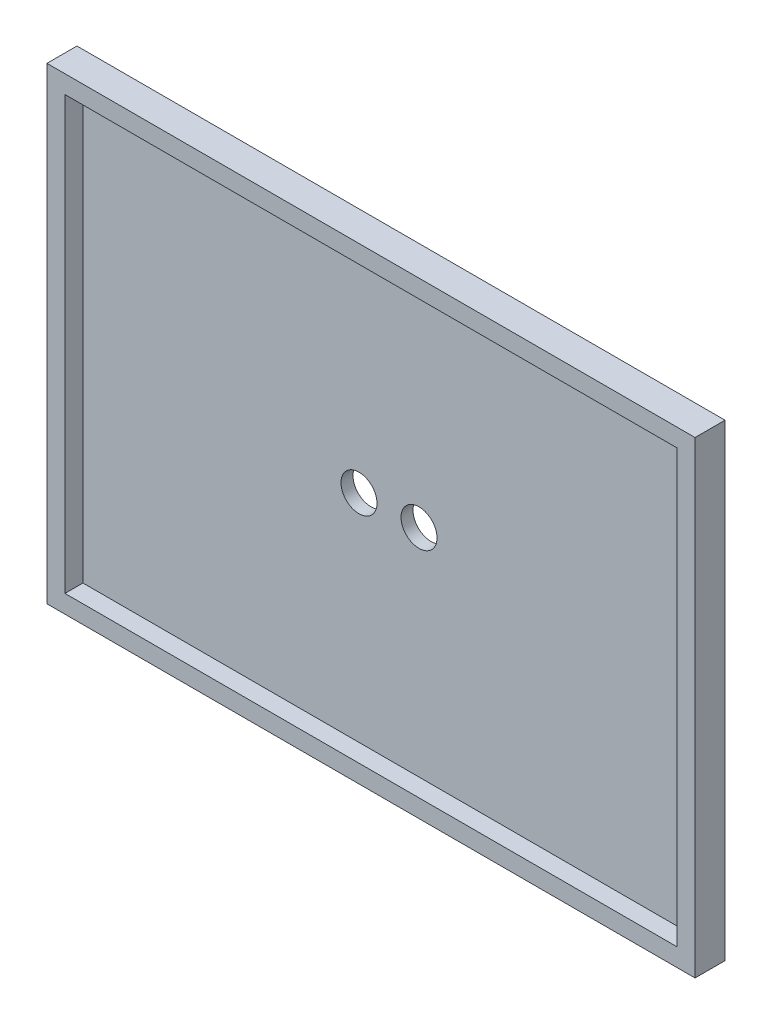
ISO-10303-21;
HEADER;
FILE_DESCRIPTION(('STEP AP214'),'2;1');
FILE_NAME('part.step','',(''),(''),'','','');
FILE_SCHEMA(('AUTOMOTIVE_DESIGN { 1 0 10303 214 1 1 1 1 }'));
ENDSEC;
DATA;
#1=APPLICATION_CONTEXT('core data for automotive mechanical design processes');
#2=APPLICATION_PROTOCOL_DEFINITION('international standard','automotive_design',2000,#1);
#3=PRODUCT_CONTEXT('',#1,'mechanical');
#4=PRODUCT('Part','Part','',(#3));
#5=PRODUCT_RELATED_PRODUCT_CATEGORY('part','',(#4));
#6=PRODUCT_DEFINITION_FORMATION('','',#4);
#7=PRODUCT_DEFINITION_CONTEXT('part definition',#1,'design');
#8=PRODUCT_DEFINITION('design','',#6,#7);
#9=PRODUCT_DEFINITION_SHAPE('','',#8);
#10=(LENGTH_UNIT() NAMED_UNIT(*) SI_UNIT(.MILLI.,.METRE.));
#11=(NAMED_UNIT(*) PLANE_ANGLE_UNIT() SI_UNIT($,.RADIAN.));
#12=(NAMED_UNIT(*) SI_UNIT($,.STERADIAN.) SOLID_ANGLE_UNIT());
#13=UNCERTAINTY_MEASURE_WITH_UNIT(LENGTH_MEASURE(1.E-05),#10,'distance_accuracy_value','');
#14=(GEOMETRIC_REPRESENTATION_CONTEXT(3) GLOBAL_UNCERTAINTY_ASSIGNED_CONTEXT((#13)) GLOBAL_UNIT_ASSIGNED_CONTEXT((#10,
#11,#12)) REPRESENTATION_CONTEXT('',''));
#15=CARTESIAN_POINT('',(0.,0.,0.));
#16=DIRECTION('',(0.,0.,1.));
#17=DIRECTION('',(1.,0.,0.));
#18=AXIS2_PLACEMENT_3D('',#15,#16,#17);
#19=CARTESIAN_POINT('',(-88.9204535147392,48.0244897959184,5.));
#20=DIRECTION('',(1.,0.,0.));
#21=DIRECTION('',(0.,0.,-1.));
#22=AXIS2_PLACEMENT_3D('',#19,#20,#21);
#23=PLANE('',#22);
#24=DIRECTION('',(0.,-1.,0.));
#25=VECTOR('',#24,1.);
#26=CARTESIAN_POINT('',(-88.9204535147392,48.0244897959184,0.));
#27=LINE('',#26,#25);
#28=CARTESIAN_POINT('',(-88.9204535147392,48.0244897959184,0.));
#29=VERTEX_POINT('',#28);
#30=CARTESIAN_POINT('',(-88.9204535147392,-29.9755102040816,0.));
#31=VERTEX_POINT('',#30);
#32=EDGE_CURVE('E162',#29,#31,#27,.T.);
#33=ORIENTED_EDGE('',*,*,#32,.T.);
#34=DIRECTION('',(0.,0.,-1.));
#35=VECTOR('',#34,1.);
#36=CARTESIAN_POINT('',(-88.9204535147392,-29.9755102040816,5.));
#37=LINE('',#36,#35);
#38=CARTESIAN_POINT('',(-88.9204535147392,-29.9755102040816,5.));
#39=VERTEX_POINT('',#38);
#40=EDGE_CURVE('E47',#39,#31,#37,.T.);
#41=ORIENTED_EDGE('',*,*,#40,.F.);
#42=DIRECTION('',(0.,-1.,0.));
#43=VECTOR('',#42,1.);
#44=CARTESIAN_POINT('',(-88.9204535147392,48.0244897959184,5.));
#45=LINE('',#44,#43);
#46=CARTESIAN_POINT('',(-88.9204535147392,48.0244897959184,5.));
#47=VERTEX_POINT('',#46);
#48=EDGE_CURVE('E168',#47,#39,#45,.T.);
#49=ORIENTED_EDGE('',*,*,#48,.F.);
#50=DIRECTION('',(0.,0.,-1.));
#51=VECTOR('',#50,1.);
#52=CARTESIAN_POINT('',(-88.9204535147392,48.0244897959184,5.));
#53=LINE('',#52,#51);
#54=EDGE_CURVE('E178',#47,#29,#53,.T.);
#55=ORIENTED_EDGE('',*,*,#54,.T.);
#56=EDGE_LOOP('',(#33,#41,#49,#55));
#57=FACE_BOUND('',#56,.T.);
#58=ADVANCED_FACE('F39',(#57),#23,.F.);
#59=CARTESIAN_POINT('',(-88.9204535147392,-29.9755102040816,5.));
#60=DIRECTION('',(0.,1.,0.));
#61=DIRECTION('',(0.,0.,1.));
#62=AXIS2_PLACEMENT_3D('',#59,#60,#61);
#63=PLANE('',#62);
#64=DIRECTION('',(1.,0.,0.));
#65=VECTOR('',#64,1.);
#66=CARTESIAN_POINT('',(-88.9204535147392,-29.9755102040816,0.));
#67=LINE('',#66,#65);
#68=CARTESIAN_POINT('',(19.0795464852608,-29.9755102040816,0.));
#69=VERTEX_POINT('',#68);
#70=EDGE_CURVE('E182',#31,#69,#67,.T.);
#71=ORIENTED_EDGE('',*,*,#70,.T.);
#72=DIRECTION('',(0.,0.,-1.));
#73=VECTOR('',#72,1.);
#74=CARTESIAN_POINT('',(19.0795464852608,-29.9755102040816,5.));
#75=LINE('',#74,#73);
#76=CARTESIAN_POINT('',(19.0795464852608,-29.9755102040816,5.));
#77=VERTEX_POINT('',#76);
#78=EDGE_CURVE('E195',#77,#69,#75,.T.);
#79=ORIENTED_EDGE('',*,*,#78,.F.);
#80=DIRECTION('',(1.,0.,0.));
#81=VECTOR('',#80,1.);
#82=CARTESIAN_POINT('',(-88.9204535147392,-29.9755102040816,5.));
#83=LINE('',#82,#81);
#84=EDGE_CURVE('E92',#39,#77,#83,.T.);
#85=ORIENTED_EDGE('',*,*,#84,.F.);
#86=ORIENTED_EDGE('',*,*,#40,.T.);
#87=EDGE_LOOP('',(#71,#79,#85,#86));
#88=FACE_BOUND('',#87,.T.);
#89=ADVANCED_FACE('F200',(#88),#63,.F.);
#90=CARTESIAN_POINT('',(19.0795464852608,48.0244897959184,5.));
#91=DIRECTION('',(-1.,0.,0.));
#92=DIRECTION('',(0.,-1.,0.));
#93=AXIS2_PLACEMENT_3D('',#90,#91,#92);
#94=PLANE('',#93);
#95=DIRECTION('',(0.,1.,0.));
#96=VECTOR('',#95,1.);
#97=CARTESIAN_POINT('',(19.0795464852608,48.0244897959184,0.));
#98=LINE('',#97,#96);
#99=CARTESIAN_POINT('',(19.0795464852608,48.0244897959184,0.));
#100=VERTEX_POINT('',#99);
#101=EDGE_CURVE('E185',#69,#100,#98,.T.);
#102=ORIENTED_EDGE('',*,*,#101,.T.);
#103=DIRECTION('',(0.,0.,-1.));
#104=VECTOR('',#103,1.);
#105=CARTESIAN_POINT('',(19.0795464852608,48.0244897959184,5.));
#106=LINE('',#105,#104);
#107=CARTESIAN_POINT('',(19.0795464852608,48.0244897959184,5.));
#108=VERTEX_POINT('',#107);
#109=EDGE_CURVE('E192',#108,#100,#106,.T.);
#110=ORIENTED_EDGE('',*,*,#109,.F.);
#111=DIRECTION('',(0.,1.,0.));
#112=VECTOR('',#111,1.);
#113=CARTESIAN_POINT('',(19.0795464852608,48.0244897959184,5.));
#114=LINE('',#113,#112);
#115=EDGE_CURVE('E173',#77,#108,#114,.T.);
#116=ORIENTED_EDGE('',*,*,#115,.F.);
#117=ORIENTED_EDGE('',*,*,#78,.T.);
#118=EDGE_LOOP('',(#102,#110,#116,#117));
#119=FACE_BOUND('',#118,.T.);
#120=ADVANCED_FACE('F209',(#119),#94,.F.);
#121=CARTESIAN_POINT('',(-88.9204535147392,48.0244897959184,5.));
#122=DIRECTION('',(0.,-1.,0.));
#123=DIRECTION('',(0.,0.,-1.));
#124=AXIS2_PLACEMENT_3D('',#121,#122,#123);
#125=PLANE('',#124);
#126=DIRECTION('',(-1.,0.,0.));
#127=VECTOR('',#126,1.);
#128=CARTESIAN_POINT('',(-88.9204535147392,48.0244897959184,0.));
#129=LINE('',#128,#127);
#130=EDGE_CURVE('E84',#100,#29,#129,.T.);
#131=ORIENTED_EDGE('',*,*,#130,.T.);
#132=ORIENTED_EDGE('',*,*,#54,.F.);
#133=DIRECTION('',(-1.,0.,0.));
#134=VECTOR('',#133,1.);
#135=CARTESIAN_POINT('',(-88.9204535147392,48.0244897959184,5.));
#136=LINE('',#135,#134);
#137=EDGE_CURVE('E63',#108,#47,#136,.T.);
#138=ORIENTED_EDGE('',*,*,#137,.F.);
#139=ORIENTED_EDGE('',*,*,#109,.T.);
#140=EDGE_LOOP('',(#131,#132,#138,#139));
#141=FACE_BOUND('',#140,.T.);
#142=ADVANCED_FACE('F211',(#141),#125,.F.);
#143=CARTESIAN_POINT('',(0.,0.,5.));
#144=DIRECTION('',(0.,0.,1.));
#145=DIRECTION('',(1.,0.,0.));
#146=AXIS2_PLACEMENT_3D('',#143,#144,#145);
#147=PLANE('',#146);
#148=DIRECTION('',(0.,-1.,0.));
#149=VECTOR('',#148,1.);
#150=CARTESIAN_POINT('',(-85.9204535147392,45.0244897959184,5.));
#151=LINE('',#150,#149);
#152=CARTESIAN_POINT('',(-85.9204535147392,45.0244897959184,5.));
#153=VERTEX_POINT('',#152);
#154=CARTESIAN_POINT('',(-85.9204535147392,-26.9755102040816,5.));
#155=VERTEX_POINT('',#154);
#156=EDGE_CURVE('E54',#153,#155,#151,.T.);
#157=ORIENTED_EDGE('',*,*,#156,.F.);
#158=DIRECTION('',(-1.,0.,0.));
#159=VECTOR('',#158,1.);
#160=CARTESIAN_POINT('',(-85.9204535147392,45.0244897959184,5.));
#161=LINE('',#160,#159);
#162=CARTESIAN_POINT('',(16.0795464852608,45.0244897959184,5.));
#163=VERTEX_POINT('',#162);
#164=EDGE_CURVE('E137',#163,#153,#161,.T.);
#165=ORIENTED_EDGE('',*,*,#164,.F.);
#166=DIRECTION('',(0.,1.,0.));
#167=VECTOR('',#166,1.);
#168=CARTESIAN_POINT('',(16.0795464852608,45.0244897959184,5.));
#169=LINE('',#168,#167);
#170=CARTESIAN_POINT('',(16.0795464852608,-26.9755102040816,5.));
#171=VERTEX_POINT('',#170);
#172=EDGE_CURVE('E141',#171,#163,#169,.T.);
#173=ORIENTED_EDGE('',*,*,#172,.F.);
#174=DIRECTION('',(1.,0.,0.));
#175=VECTOR('',#174,1.);
#176=CARTESIAN_POINT('',(-85.9204535147392,-26.9755102040816,5.));
#177=LINE('',#176,#175);
#178=EDGE_CURVE('E153',#155,#171,#177,.T.);
#179=ORIENTED_EDGE('',*,*,#178,.F.);
#180=EDGE_LOOP('',(#157,#165,#173,#179));
#181=FACE_BOUND('',#180,.T.);
#182=ORIENTED_EDGE('',*,*,#48,.T.);
#183=ORIENTED_EDGE('',*,*,#84,.T.);
#184=ORIENTED_EDGE('',*,*,#115,.T.);
#185=ORIENTED_EDGE('',*,*,#137,.T.);
#186=EDGE_LOOP('',(#182,#183,#184,#185));
#187=FACE_BOUND('',#186,.T.);
#188=ADVANCED_FACE('F212',(#181,#187),#147,.T.);
#189=CARTESIAN_POINT('',(0.,0.,0.));
#190=DIRECTION('',(0.,0.,1.));
#191=DIRECTION('',(1.,0.,0.));
#192=AXIS2_PLACEMENT_3D('',#189,#190,#191);
#193=PLANE('',#192);
#194=CARTESIAN_POINT('',(-34.9204535147392,28.0244897959184,0.));
#195=DIRECTION('',(0.,0.,-1.));
#196=DIRECTION('',(-1.,0.,0.));
#197=AXIS2_PLACEMENT_3D('',#194,#195,#196);
#198=CIRCLE('',#197,10.);
#199=CARTESIAN_POINT('',(-44.9204535147392,28.0244897959184,0.));
#200=VERTEX_POINT('',#199);
#201=EDGE_CURVE('E11',#200,#200,#198,.T.);
#202=ORIENTED_EDGE('',*,*,#201,.F.);
#203=EDGE_LOOP('',(#202));
#204=FACE_BOUND('',#203,.T.);
#205=CARTESIAN_POINT('',(-39.9204535147392,9.02448979591837,0.));
#206=DIRECTION('',(0.,0.,1.));
#207=DIRECTION('',(1.,0.,0.));
#208=AXIS2_PLACEMENT_3D('',#205,#206,#207);
#209=CIRCLE('',#208,3.);
#210=CARTESIAN_POINT('',(-36.9204535147392,9.02448979591837,0.));
#211=VERTEX_POINT('',#210);
#212=EDGE_CURVE('E144',#211,#211,#209,.T.);
#213=ORIENTED_EDGE('',*,*,#212,.T.);
#214=EDGE_LOOP('',(#213));
#215=FACE_BOUND('',#214,.T.);
#216=CARTESIAN_POINT('',(-29.9204535147392,9.02448979591837,0.));
#217=DIRECTION('',(0.,0.,1.));
#218=DIRECTION('',(1.,0.,0.));
#219=AXIS2_PLACEMENT_3D('',#216,#217,#218);
#220=CIRCLE('',#219,3.);
#221=CARTESIAN_POINT('',(-26.9204535147392,9.02448979591837,0.));
#222=VERTEX_POINT('',#221);
#223=EDGE_CURVE('E377',#222,#222,#220,.T.);
#224=ORIENTED_EDGE('',*,*,#223,.T.);
#225=EDGE_LOOP('',(#224));
#226=FACE_BOUND('',#225,.T.);
#227=ORIENTED_EDGE('',*,*,#32,.F.);
#228=ORIENTED_EDGE('',*,*,#130,.F.);
#229=ORIENTED_EDGE('',*,*,#101,.F.);
#230=ORIENTED_EDGE('',*,*,#70,.F.);
#231=EDGE_LOOP('',(#227,#228,#229,#230));
#232=FACE_BOUND('',#231,.T.);
#233=ADVANCED_FACE('F205',(#204,#215,#226,#232),#193,.F.);
#234=CARTESIAN_POINT('',(-85.9204535147392,45.0244897959184,2.));
#235=DIRECTION('',(-1.,0.,0.));
#236=DIRECTION('',(0.,-1.,0.));
#237=AXIS2_PLACEMENT_3D('',#234,#235,#236);
#238=PLANE('',#237);
#239=ORIENTED_EDGE('',*,*,#156,.T.);
#240=DIRECTION('',(0.,0.,1.));
#241=VECTOR('',#240,1.);
#242=CARTESIAN_POINT('',(-85.9204535147392,-26.9755102040816,2.));
#243=LINE('',#242,#241);
#244=CARTESIAN_POINT('',(-85.9204535147392,-26.9755102040816,2.));
#245=VERTEX_POINT('',#244);
#246=EDGE_CURVE('E112',#245,#155,#243,.T.);
#247=ORIENTED_EDGE('',*,*,#246,.F.);
#248=DIRECTION('',(0.,-1.,0.));
#249=VECTOR('',#248,1.);
#250=CARTESIAN_POINT('',(-85.9204535147392,45.0244897959184,2.));
#251=LINE('',#250,#249);
#252=CARTESIAN_POINT('',(-85.9204535147392,45.0244897959184,2.));
#253=VERTEX_POINT('',#252);
#254=EDGE_CURVE('E116',#253,#245,#251,.T.);
#255=ORIENTED_EDGE('',*,*,#254,.F.);
#256=DIRECTION('',(0.,0.,1.));
#257=VECTOR('',#256,1.);
#258=CARTESIAN_POINT('',(-85.9204535147392,45.0244897959184,2.));
#259=LINE('',#258,#257);
#260=EDGE_CURVE('E159',#253,#153,#259,.T.);
#261=ORIENTED_EDGE('',*,*,#260,.T.);
#262=EDGE_LOOP('',(#239,#247,#255,#261));
#263=FACE_BOUND('',#262,.T.);
#264=ADVANCED_FACE('F114',(#263),#238,.F.);
#265=CARTESIAN_POINT('',(-85.9204535147392,45.0244897959184,2.));
#266=DIRECTION('',(0.,1.,0.));
#267=DIRECTION('',(0.,0.,1.));
#268=AXIS2_PLACEMENT_3D('',#265,#266,#267);
#269=PLANE('',#268);
#270=ORIENTED_EDGE('',*,*,#164,.T.);
#271=ORIENTED_EDGE('',*,*,#260,.F.);
#272=DIRECTION('',(-1.,0.,0.));
#273=VECTOR('',#272,1.);
#274=CARTESIAN_POINT('',(-85.9204535147392,45.0244897959184,2.));
#275=LINE('',#274,#273);
#276=CARTESIAN_POINT('',(16.0795464852608,45.0244897959184,2.));
#277=VERTEX_POINT('',#276);
#278=EDGE_CURVE('E123',#277,#253,#275,.T.);
#279=ORIENTED_EDGE('',*,*,#278,.F.);
#280=DIRECTION('',(0.,0.,1.));
#281=VECTOR('',#280,1.);
#282=CARTESIAN_POINT('',(16.0795464852608,45.0244897959184,2.));
#283=LINE('',#282,#281);
#284=EDGE_CURVE('E163',#277,#163,#283,.T.);
#285=ORIENTED_EDGE('',*,*,#284,.T.);
#286=EDGE_LOOP('',(#270,#271,#279,#285));
#287=FACE_BOUND('',#286,.T.);
#288=ADVANCED_FACE('F253',(#287),#269,.F.);
#289=CARTESIAN_POINT('',(16.0795464852608,45.0244897959184,2.));
#290=DIRECTION('',(1.,0.,0.));
#291=DIRECTION('',(0.,1.,0.));
#292=AXIS2_PLACEMENT_3D('',#289,#290,#291);
#293=PLANE('',#292);
#294=ORIENTED_EDGE('',*,*,#172,.T.);
#295=ORIENTED_EDGE('',*,*,#284,.F.);
#296=DIRECTION('',(0.,1.,0.));
#297=VECTOR('',#296,1.);
#298=CARTESIAN_POINT('',(16.0795464852608,45.0244897959184,2.));
#299=LINE('',#298,#297);
#300=CARTESIAN_POINT('',(16.0795464852608,-26.9755102040816,2.));
#301=VERTEX_POINT('',#300);
#302=EDGE_CURVE('E132',#301,#277,#299,.T.);
#303=ORIENTED_EDGE('',*,*,#302,.F.);
#304=DIRECTION('',(0.,0.,1.));
#305=VECTOR('',#304,1.);
#306=CARTESIAN_POINT('',(16.0795464852608,-26.9755102040816,2.));
#307=LINE('',#306,#305);
#308=EDGE_CURVE('E122',#301,#171,#307,.T.);
#309=ORIENTED_EDGE('',*,*,#308,.T.);
#310=EDGE_LOOP('',(#294,#295,#303,#309));
#311=FACE_BOUND('',#310,.T.);
#312=ADVANCED_FACE('F261',(#311),#293,.F.);
#313=CARTESIAN_POINT('',(-85.9204535147392,-26.9755102040816,2.));
#314=DIRECTION('',(0.,-1.,0.));
#315=DIRECTION('',(0.,0.,-1.));
#316=AXIS2_PLACEMENT_3D('',#313,#314,#315);
#317=PLANE('',#316);
#318=ORIENTED_EDGE('',*,*,#178,.T.);
#319=ORIENTED_EDGE('',*,*,#308,.F.);
#320=DIRECTION('',(1.,0.,0.));
#321=VECTOR('',#320,1.);
#322=CARTESIAN_POINT('',(-85.9204535147392,-26.9755102040816,2.));
#323=LINE('',#322,#321);
#324=EDGE_CURVE('E126',#245,#301,#323,.T.);
#325=ORIENTED_EDGE('',*,*,#324,.F.);
#326=ORIENTED_EDGE('',*,*,#246,.T.);
#327=EDGE_LOOP('',(#318,#319,#325,#326));
#328=FACE_BOUND('',#327,.T.);
#329=ADVANCED_FACE('F127',(#328),#317,.F.);
#330=CARTESIAN_POINT('',(0.,0.,2.));
#331=DIRECTION('',(0.,0.,1.));
#332=DIRECTION('',(1.,0.,0.));
#333=AXIS2_PLACEMENT_3D('',#330,#331,#332);
#334=PLANE('',#333);
#335=CARTESIAN_POINT('',(-39.9204535147392,9.02448979591837,2.));
#336=DIRECTION('',(0.,0.,1.));
#337=DIRECTION('',(1.,0.,0.));
#338=AXIS2_PLACEMENT_3D('',#335,#336,#337);
#339=CIRCLE('',#338,3.);
#340=CARTESIAN_POINT('',(-36.9204535147392,9.02448979591837,2.));
#341=VERTEX_POINT('',#340);
#342=EDGE_CURVE('E373',#341,#341,#339,.T.);
#343=ORIENTED_EDGE('',*,*,#342,.F.);
#344=EDGE_LOOP('',(#343));
#345=FACE_BOUND('',#344,.T.);
#346=CARTESIAN_POINT('',(-29.9204535147392,9.02448979591837,2.));
#347=DIRECTION('',(0.,0.,1.));
#348=DIRECTION('',(1.,0.,0.));
#349=AXIS2_PLACEMENT_3D('',#346,#347,#348);
#350=CIRCLE('',#349,3.);
#351=CARTESIAN_POINT('',(-26.9204535147392,9.02448979591837,2.));
#352=VERTEX_POINT('',#351);
#353=EDGE_CURVE('E372',#352,#352,#350,.T.);
#354=ORIENTED_EDGE('',*,*,#353,.F.);
#355=EDGE_LOOP('',(#354));
#356=FACE_BOUND('',#355,.T.);
#357=ORIENTED_EDGE('',*,*,#254,.T.);
#358=ORIENTED_EDGE('',*,*,#324,.T.);
#359=ORIENTED_EDGE('',*,*,#302,.T.);
#360=ORIENTED_EDGE('',*,*,#278,.T.);
#361=EDGE_LOOP('',(#357,#358,#359,#360));
#362=FACE_BOUND('',#361,.T.);
#363=ADVANCED_FACE('F134',(#345,#356,#362),#334,.T.);
#364=CARTESIAN_POINT('',(-29.9204535147392,9.02448979591837,-1.));
#365=DIRECTION('',(0.,0.,1.));
#366=DIRECTION('',(1.,0.,0.));
#367=AXIS2_PLACEMENT_3D('',#364,#365,#366);
#368=CYLINDRICAL_SURFACE('',#367,3.);
#369=ORIENTED_EDGE('',*,*,#353,.T.);
#370=EDGE_LOOP('',(#369));
#371=FACE_BOUND('',#370,.T.);
#372=ORIENTED_EDGE('',*,*,#223,.F.);
#373=EDGE_LOOP('',(#372));
#374=FACE_BOUND('',#373,.T.);
#375=ADVANCED_FACE('F288',(#371,#374),#368,.F.);
#376=CARTESIAN_POINT('',(-39.9204535147392,9.02448979591837,-1.));
#377=DIRECTION('',(0.,0.,1.));
#378=DIRECTION('',(1.,0.,0.));
#379=AXIS2_PLACEMENT_3D('',#376,#377,#378);
#380=CYLINDRICAL_SURFACE('',#379,3.);
#381=ORIENTED_EDGE('',*,*,#342,.T.);
#382=EDGE_LOOP('',(#381));
#383=FACE_BOUND('',#382,.T.);
#384=ORIENTED_EDGE('',*,*,#212,.F.);
#385=EDGE_LOOP('',(#384));
#386=FACE_BOUND('',#385,.T.);
#387=ADVANCED_FACE('F298',(#383,#386),#380,.F.);
#388=CARTESIAN_POINT('',(-34.9204535147392,10.3468202662545,-17.6776695296635));
#389=DIRECTION('',(0.,0.,-1.));
#390=DIRECTION('',(-1.,0.,0.));
#391=AXIS2_PLACEMENT_3D('',#388,#389,#390);
#392=PLANE('',#391);
#393=CARTESIAN_POINT('',(-34.9204535147392,10.3468202662545,-17.6776695296635));
#394=DIRECTION('',(0.,0.,-1.));
#395=DIRECTION('',(-1.,0.,0.));
#396=AXIS2_PLACEMENT_3D('',#393,#394,#395);
#397=CIRCLE('',#396,10.);
#398=CARTESIAN_POINT('',(-44.9204535147392,10.3468202662545,-17.6776695296635));
#399=VERTEX_POINT('',#398);
#400=EDGE_CURVE('E364',#399,#399,#397,.T.);
#401=ORIENTED_EDGE('',*,*,#400,.T.);
#402=EDGE_LOOP('',(#401));
#403=FACE_BOUND('',#402,.T.);
#404=CARTESIAN_POINT('',(-34.9204535147392,10.3468202662545,-17.6776695296635));
#405=DIRECTION('',(0.,0.,-1.));
#406=DIRECTION('',(-1.,0.,0.));
#407=AXIS2_PLACEMENT_3D('',#404,#405,#406);
#408=CIRCLE('',#407,3.);
#409=CARTESIAN_POINT('',(-37.9204535147392,10.3468202662545,-17.6776695296635));
#410=VERTEX_POINT('',#409);
#411=EDGE_CURVE('E360',#410,#410,#408,.T.);
#412=ORIENTED_EDGE('',*,*,#411,.F.);
#413=EDGE_LOOP('',(#412));
#414=FACE_BOUND('',#413,.T.);
#415=ADVANCED_FACE('F308',(#403,#414),#392,.T.);
#416=DIRECTION('',(0.,0.707106781186554,0.707106781186541));
#417=VECTOR('',#416,1.);
#418=SURFACE_OF_LINEAR_EXTRUSION('',#397,#417);
#419=ORIENTED_EDGE('',*,*,#400,.F.);
#420=EDGE_LOOP('',(#419));
#421=FACE_BOUND('',#420,.T.);
#422=ORIENTED_EDGE('',*,*,#201,.T.);
#423=EDGE_LOOP('',(#422));
#424=FACE_BOUND('',#423,.T.);
#425=ADVANCED_FACE('F324',(#421,#424),#418,.F.);
#426=DIRECTION('',(0.,0.707106781186554,0.707106781186541));
#427=VECTOR('',#426,1.);
#428=SURFACE_OF_LINEAR_EXTRUSION('',#408,#427);
#429=ORIENTED_EDGE('',*,*,#411,.T.);
#430=EDGE_LOOP('',(#429));
#431=FACE_BOUND('',#430,.T.);
#432=CARTESIAN_POINT('',(-34.9204535147392,28.0244897959184,0.));
#433=DIRECTION('',(0.,0.,-1.));
#434=DIRECTION('',(-1.,0.,0.));
#435=AXIS2_PLACEMENT_3D('',#432,#433,#434);
#436=CIRCLE('',#435,3.);
#437=CARTESIAN_POINT('',(-37.9204535147392,28.0244897959184,0.));
#438=VERTEX_POINT('',#437);
#439=EDGE_CURVE('E357',#438,#438,#436,.T.);
#440=ORIENTED_EDGE('',*,*,#439,.F.);
#441=EDGE_LOOP('',(#440));
#442=FACE_BOUND('',#441,.T.);
#443=ADVANCED_FACE('F334',(#431,#442),#428,.T.);
#444=ORIENTED_EDGE('',*,*,#439,.T.);
#445=EDGE_LOOP('',(#444));
#446=FACE_BOUND('',#445,.T.);
#447=ADVANCED_FACE('F222',(#446),#193,.F.);
#448=CLOSED_SHELL('',(#58,#89,#120,#142,#188,#233,#264,#288,#312,#329,#363,#375,#387,#415,#425,
#443,#447));
#449=MANIFOLD_SOLID_BREP('B2',#448);
#450=ADVANCED_BREP_SHAPE_REPRESENTATION('',(#18,#449),#14);
#451=SHAPE_DEFINITION_REPRESENTATION(#9,#450);
ENDSEC;
END-ISO-10303-21;
